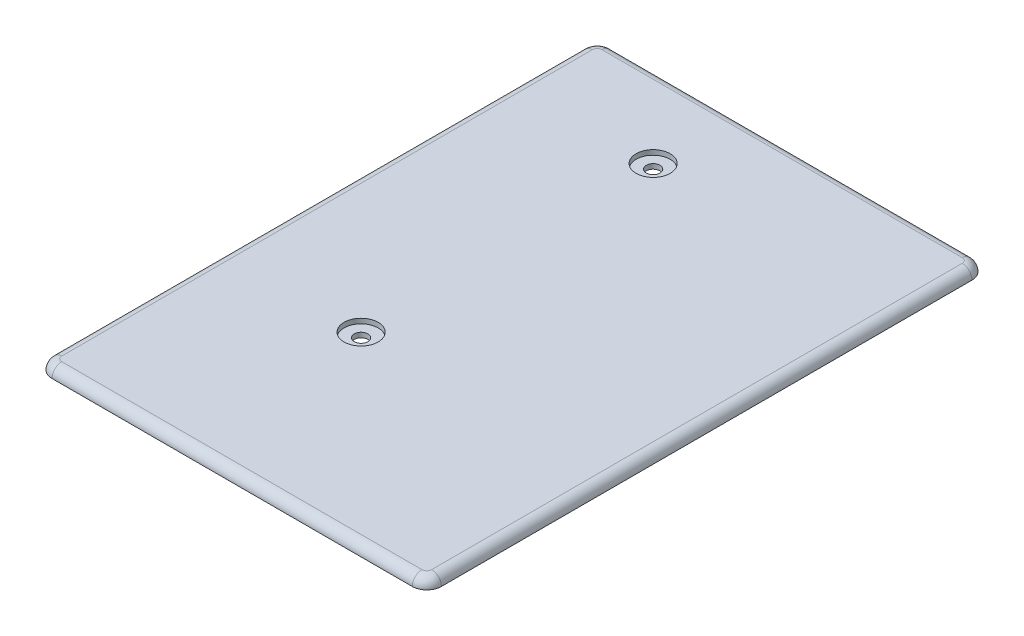
ISO-10303-21;
HEADER;
FILE_DESCRIPTION(('STEP AP214'),'2;1');
FILE_NAME('part.step','',(''),(''),'','','');
FILE_SCHEMA(('AUTOMOTIVE_DESIGN { 1 0 10303 214 1 1 1 1 }'));
ENDSEC;
DATA;
#1=APPLICATION_CONTEXT('core data for automotive mechanical design processes');
#2=APPLICATION_PROTOCOL_DEFINITION('international standard','automotive_design',2000,#1);
#3=PRODUCT_CONTEXT('',#1,'mechanical');
#4=PRODUCT('Part','Part','',(#3));
#5=PRODUCT_RELATED_PRODUCT_CATEGORY('part','',(#4));
#6=PRODUCT_DEFINITION_FORMATION('','',#4);
#7=PRODUCT_DEFINITION_CONTEXT('part definition',#1,'design');
#8=PRODUCT_DEFINITION('design','',#6,#7);
#9=PRODUCT_DEFINITION_SHAPE('','',#8);
#10=(LENGTH_UNIT() NAMED_UNIT(*) SI_UNIT(.MILLI.,.METRE.));
#11=(NAMED_UNIT(*) PLANE_ANGLE_UNIT() SI_UNIT($,.RADIAN.));
#12=(NAMED_UNIT(*) SI_UNIT($,.STERADIAN.) SOLID_ANGLE_UNIT());
#13=UNCERTAINTY_MEASURE_WITH_UNIT(LENGTH_MEASURE(1.E-05),#10,'distance_accuracy_value','');
#14=(GEOMETRIC_REPRESENTATION_CONTEXT(3) GLOBAL_UNCERTAINTY_ASSIGNED_CONTEXT((#13)) GLOBAL_UNIT_ASSIGNED_CONTEXT((#10,
#11,#12)) REPRESENTATION_CONTEXT('',''));
#15=CARTESIAN_POINT('',(0.,0.,0.));
#16=DIRECTION('',(0.,0.,1.));
#17=DIRECTION('',(1.,0.,0.));
#18=AXIS2_PLACEMENT_3D('',#15,#16,#17);
#19=CARTESIAN_POINT('',(28.5,53.,-38.));
#20=DIRECTION('',(0.,1.,0.));
#21=DIRECTION('',(0.,0.,1.));
#22=AXIS2_PLACEMENT_3D('',#19,#20,#21);
#23=CYLINDRICAL_SURFACE('',#22,3.5);
#24=CARTESIAN_POINT('',(28.5,53.,-38.));
#25=DIRECTION('',(0.,1.,0.));
#26=DIRECTION('',(0.,0.,1.));
#27=AXIS2_PLACEMENT_3D('',#24,#25,#26);
#28=CIRCLE('',#27,3.5);
#29=CARTESIAN_POINT('',(28.5,53.,-34.5));
#30=VERTEX_POINT('',#29);
#31=EDGE_CURVE('E117',#30,#30,#28,.T.);
#32=ORIENTED_EDGE('',*,*,#31,.F.);
#33=EDGE_LOOP('',(#32));
#34=FACE_BOUND('',#33,.T.);
#35=CARTESIAN_POINT('',(28.5,54.,-38.));
#36=DIRECTION('',(0.,1.,0.));
#37=DIRECTION('',(0.,0.,1.));
#38=AXIS2_PLACEMENT_3D('',#35,#36,#37);
#39=CIRCLE('',#38,3.5);
#40=CARTESIAN_POINT('',(28.5,54.,-34.5));
#41=VERTEX_POINT('',#40);
#42=EDGE_CURVE('E182',#41,#41,#39,.T.);
#43=ORIENTED_EDGE('',*,*,#42,.T.);
#44=EDGE_LOOP('',(#43));
#45=FACE_BOUND('',#44,.T.);
#46=ADVANCED_FACE('F36',(#34,#45),#23,.F.);
#47=CARTESIAN_POINT('',(28.5,53.,-98.));
#48=DIRECTION('',(0.,1.,0.));
#49=DIRECTION('',(0.,0.,1.));
#50=AXIS2_PLACEMENT_3D('',#47,#48,#49);
#51=CYLINDRICAL_SURFACE('',#50,3.5);
#52=CARTESIAN_POINT('',(28.5,53.,-98.));
#53=DIRECTION('',(0.,1.,0.));
#54=DIRECTION('',(0.,0.,1.));
#55=AXIS2_PLACEMENT_3D('',#52,#53,#54);
#56=CIRCLE('',#55,3.5);
#57=CARTESIAN_POINT('',(28.5,53.,-94.5));
#58=VERTEX_POINT('',#57);
#59=EDGE_CURVE('E179',#58,#58,#56,.T.);
#60=ORIENTED_EDGE('',*,*,#59,.F.);
#61=EDGE_LOOP('',(#60));
#62=FACE_BOUND('',#61,.T.);
#63=CARTESIAN_POINT('',(28.5,54.,-98.));
#64=DIRECTION('',(0.,1.,0.));
#65=DIRECTION('',(0.,0.,1.));
#66=AXIS2_PLACEMENT_3D('',#63,#64,#65);
#67=CIRCLE('',#66,3.5);
#68=CARTESIAN_POINT('',(28.5,54.,-94.5));
#69=VERTEX_POINT('',#68);
#70=EDGE_CURVE('E162',#69,#69,#67,.T.);
#71=ORIENTED_EDGE('',*,*,#70,.T.);
#72=EDGE_LOOP('',(#71));
#73=FACE_BOUND('',#72,.T.);
#74=ADVANCED_FACE('F231',(#62,#73),#51,.F.);
#75=CARTESIAN_POINT('',(2.99999999999999,52.,-112.));
#76=DIRECTION('',(0.,1.,0.));
#77=DIRECTION('',(0.,0.,1.));
#78=AXIS2_PLACEMENT_3D('',#75,#76,#77);
#79=DEGENERATE_TOROIDAL_SURFACE('',#78,1.,2.,.T.);
#80=CARTESIAN_POINT('',(2.99999999999999,52.,-113.));
#81=DIRECTION('',(1.,0.,0.));
#82=DIRECTION('',(0.,0.,-1.));
#83=AXIS2_PLACEMENT_3D('',#80,#81,#82);
#84=CIRCLE('',#83,2.);
#85=CARTESIAN_POINT('',(2.99999999999999,52.,-115.));
#86=VERTEX_POINT('',#85);
#87=CARTESIAN_POINT('',(2.99999999999999,54.,-113.));
#88=VERTEX_POINT('',#87);
#89=EDGE_CURVE('E157',#86,#88,#84,.T.);
#90=ORIENTED_EDGE('',*,*,#89,.F.);
#91=CARTESIAN_POINT('',(2.99999999999999,52.,-112.));
#92=DIRECTION('',(0.,1.,0.));
#93=DIRECTION('',(0.,0.,1.));
#94=AXIS2_PLACEMENT_3D('',#91,#92,#93);
#95=CIRCLE('',#94,3.);
#96=CARTESIAN_POINT('',(0.,52.,-112.));
#97=VERTEX_POINT('',#96);
#98=EDGE_CURVE('E136',#97,#86,#95,.F.);
#99=ORIENTED_EDGE('',*,*,#98,.F.);
#100=CARTESIAN_POINT('',(1.99999999999999,52.,-112.));
#101=DIRECTION('',(0.,0.,1.));
#102=DIRECTION('',(1.,0.,0.));
#103=AXIS2_PLACEMENT_3D('',#100,#101,#102);
#104=CIRCLE('',#103,2.);
#105=CARTESIAN_POINT('',(1.99999999999999,54.,-112.));
#106=VERTEX_POINT('',#105);
#107=EDGE_CURVE('E160',#106,#97,#104,.T.);
#108=ORIENTED_EDGE('',*,*,#107,.F.);
#109=CARTESIAN_POINT('',(2.99999999999999,54.,-112.));
#110=DIRECTION('',(0.,1.,0.));
#111=DIRECTION('',(0.,0.,1.));
#112=AXIS2_PLACEMENT_3D('',#109,#110,#111);
#113=CIRCLE('',#112,1.);
#114=EDGE_CURVE('E197',#88,#106,#113,.T.);
#115=ORIENTED_EDGE('',*,*,#114,.F.);
#116=EDGE_LOOP('',(#90,#99,#108,#115));
#117=FACE_BOUND('',#116,.T.);
#118=ADVANCED_FACE('F38',(#117),#79,.T.);
#119=CARTESIAN_POINT('',(1.99999999999999,52.,-112.));
#120=DIRECTION('',(0.,0.,-1.));
#121=DIRECTION('',(-1.,0.,0.));
#122=AXIS2_PLACEMENT_3D('',#119,#120,#121);
#123=CYLINDRICAL_SURFACE('',#122,2.);
#124=ORIENTED_EDGE('',*,*,#107,.T.);
#125=DIRECTION('',(0.,0.,1.));
#126=VECTOR('',#125,1.);
#127=CARTESIAN_POINT('',(0.,52.,-112.));
#128=LINE('',#127,#126);
#129=CARTESIAN_POINT('',(0.,52.,-3.));
#130=VERTEX_POINT('',#129);
#131=EDGE_CURVE('E134',#130,#97,#128,.F.);
#132=ORIENTED_EDGE('',*,*,#131,.F.);
#133=CARTESIAN_POINT('',(2.,52.,-3.));
#134=DIRECTION('',(0.,0.,1.));
#135=DIRECTION('',(1.,0.,0.));
#136=AXIS2_PLACEMENT_3D('',#133,#134,#135);
#137=CIRCLE('',#136,2.);
#138=CARTESIAN_POINT('',(2.,54.,-3.));
#139=VERTEX_POINT('',#138);
#140=EDGE_CURVE('E154',#139,#130,#137,.T.);
#141=ORIENTED_EDGE('',*,*,#140,.F.);
#142=DIRECTION('',(0.,0.,1.));
#143=VECTOR('',#142,1.);
#144=CARTESIAN_POINT('',(2.,54.,-3.));
#145=LINE('',#144,#143);
#146=EDGE_CURVE('E199',#106,#139,#145,.T.);
#147=ORIENTED_EDGE('',*,*,#146,.F.);
#148=EDGE_LOOP('',(#124,#132,#141,#147));
#149=FACE_BOUND('',#148,.T.);
#150=ADVANCED_FACE('F301',(#149),#123,.T.);
#151=CARTESIAN_POINT('',(2.99999999999999,52.,-113.));
#152=DIRECTION('',(1.,0.,0.));
#153=DIRECTION('',(0.,0.,-1.));
#154=AXIS2_PLACEMENT_3D('',#151,#152,#153);
#155=CYLINDRICAL_SURFACE('',#154,2.);
#156=ORIENTED_EDGE('',*,*,#89,.T.);
#157=DIRECTION('',(-1.,0.,0.));
#158=VECTOR('',#157,1.);
#159=CARTESIAN_POINT('',(2.99999999999999,54.,-113.));
#160=LINE('',#159,#158);
#161=CARTESIAN_POINT('',(77.,54.,-113.));
#162=VERTEX_POINT('',#161);
#163=EDGE_CURVE('E195',#162,#88,#160,.T.);
#164=ORIENTED_EDGE('',*,*,#163,.F.);
#165=CARTESIAN_POINT('',(77.,52.,-113.));
#166=DIRECTION('',(1.,0.,0.));
#167=DIRECTION('',(0.,0.,-1.));
#168=AXIS2_PLACEMENT_3D('',#165,#166,#167);
#169=CIRCLE('',#168,2.);
#170=CARTESIAN_POINT('',(77.,52.,-115.));
#171=VERTEX_POINT('',#170);
#172=EDGE_CURVE('E151',#171,#162,#169,.T.);
#173=ORIENTED_EDGE('',*,*,#172,.F.);
#174=DIRECTION('',(-1.,0.,0.));
#175=VECTOR('',#174,1.);
#176=CARTESIAN_POINT('',(77.,52.,-115.));
#177=LINE('',#176,#175);
#178=EDGE_CURVE('E139',#86,#171,#177,.F.);
#179=ORIENTED_EDGE('',*,*,#178,.F.);
#180=EDGE_LOOP('',(#156,#164,#173,#179));
#181=FACE_BOUND('',#180,.T.);
#182=ADVANCED_FACE('F311',(#181),#155,.T.);
#183=CARTESIAN_POINT('',(3.,52.,-3.));
#184=DIRECTION('',(0.,1.,0.));
#185=DIRECTION('',(0.,0.,1.));
#186=AXIS2_PLACEMENT_3D('',#183,#184,#185);
#187=DEGENERATE_TOROIDAL_SURFACE('',#186,1.,2.,.T.);
#188=ORIENTED_EDGE('',*,*,#140,.T.);
#189=CARTESIAN_POINT('',(3.,52.,-3.));
#190=DIRECTION('',(0.,1.,0.));
#191=DIRECTION('',(0.,0.,1.));
#192=AXIS2_PLACEMENT_3D('',#189,#190,#191);
#193=CIRCLE('',#192,3.);
#194=CARTESIAN_POINT('',(3.,52.,0.));
#195=VERTEX_POINT('',#194);
#196=EDGE_CURVE('E131',#195,#130,#193,.F.);
#197=ORIENTED_EDGE('',*,*,#196,.F.);
#198=CARTESIAN_POINT('',(3.,52.,-2.));
#199=DIRECTION('',(1.,0.,0.));
#200=DIRECTION('',(0.,0.,-1.));
#201=AXIS2_PLACEMENT_3D('',#198,#199,#200);
#202=CIRCLE('',#201,2.);
#203=CARTESIAN_POINT('',(3.,54.,-2.));
#204=VERTEX_POINT('',#203);
#205=EDGE_CURVE('E149',#204,#195,#202,.T.);
#206=ORIENTED_EDGE('',*,*,#205,.F.);
#207=CARTESIAN_POINT('',(3.,54.,-3.));
#208=DIRECTION('',(0.,1.,0.));
#209=DIRECTION('',(0.,0.,1.));
#210=AXIS2_PLACEMENT_3D('',#207,#208,#209);
#211=CIRCLE('',#210,1.);
#212=EDGE_CURVE('E126',#139,#204,#211,.T.);
#213=ORIENTED_EDGE('',*,*,#212,.F.);
#214=EDGE_LOOP('',(#188,#197,#206,#213));
#215=FACE_BOUND('',#214,.T.);
#216=ADVANCED_FACE('F205',(#215),#187,.T.);
#217=CARTESIAN_POINT('',(77.,52.,-112.));
#218=DIRECTION('',(0.,1.,0.));
#219=DIRECTION('',(0.,0.,1.));
#220=AXIS2_PLACEMENT_3D('',#217,#218,#219);
#221=DEGENERATE_TOROIDAL_SURFACE('',#220,1.,2.,.T.);
#222=ORIENTED_EDGE('',*,*,#172,.T.);
#223=CARTESIAN_POINT('',(77.,54.,-112.));
#224=DIRECTION('',(0.,1.,0.));
#225=DIRECTION('',(0.,0.,1.));
#226=AXIS2_PLACEMENT_3D('',#223,#224,#225);
#227=CIRCLE('',#226,1.);
#228=CARTESIAN_POINT('',(78.,54.,-112.));
#229=VERTEX_POINT('',#228);
#230=EDGE_CURVE('E116',#229,#162,#227,.T.);
#231=ORIENTED_EDGE('',*,*,#230,.F.);
#232=CARTESIAN_POINT('',(78.,52.,-112.));
#233=DIRECTION('',(0.,0.,1.));
#234=DIRECTION('',(1.,0.,0.));
#235=AXIS2_PLACEMENT_3D('',#232,#233,#234);
#236=CIRCLE('',#235,2.);
#237=CARTESIAN_POINT('',(80.,52.,-112.));
#238=VERTEX_POINT('',#237);
#239=EDGE_CURVE('E113',#238,#229,#236,.T.);
#240=ORIENTED_EDGE('',*,*,#239,.F.);
#241=CARTESIAN_POINT('',(77.,52.,-112.));
#242=DIRECTION('',(0.,1.,0.));
#243=DIRECTION('',(0.,0.,1.));
#244=AXIS2_PLACEMENT_3D('',#241,#242,#243);
#245=CIRCLE('',#244,3.);
#246=EDGE_CURVE('E142',#171,#238,#245,.F.);
#247=ORIENTED_EDGE('',*,*,#246,.F.);
#248=EDGE_LOOP('',(#222,#231,#240,#247));
#249=FACE_BOUND('',#248,.T.);
#250=ADVANCED_FACE('F228',(#249),#221,.T.);
#251=CARTESIAN_POINT('',(2.99999999999999,54.,-112.));
#252=DIRECTION('',(0.,1.,0.));
#253=DIRECTION('',(0.,0.,1.));
#254=AXIS2_PLACEMENT_3D('',#251,#252,#253);
#255=PLANE('',#254);
#256=DIRECTION('',(1.,0.,0.));
#257=VECTOR('',#256,1.);
#258=CARTESIAN_POINT('',(77.,54.,-2.));
#259=LINE('',#258,#257);
#260=CARTESIAN_POINT('',(77.,54.,-2.));
#261=VERTEX_POINT('',#260);
#262=EDGE_CURVE('E122',#204,#261,#259,.T.);
#263=ORIENTED_EDGE('',*,*,#262,.T.);
#264=CARTESIAN_POINT('',(77.,54.,-3.));
#265=DIRECTION('',(0.,1.,0.));
#266=DIRECTION('',(0.,0.,1.));
#267=AXIS2_PLACEMENT_3D('',#264,#265,#266);
#268=CIRCLE('',#267,1.);
#269=CARTESIAN_POINT('',(78.,54.,-3.));
#270=VERTEX_POINT('',#269);
#271=EDGE_CURVE('E105',#261,#270,#268,.T.);
#272=ORIENTED_EDGE('',*,*,#271,.T.);
#273=DIRECTION('',(0.,0.,-1.));
#274=VECTOR('',#273,1.);
#275=CARTESIAN_POINT('',(78.,54.,-112.));
#276=LINE('',#275,#274);
#277=EDGE_CURVE('E110',#270,#229,#276,.T.);
#278=ORIENTED_EDGE('',*,*,#277,.T.);
#279=ORIENTED_EDGE('',*,*,#230,.T.);
#280=ORIENTED_EDGE('',*,*,#163,.T.);
#281=ORIENTED_EDGE('',*,*,#114,.T.);
#282=ORIENTED_EDGE('',*,*,#146,.T.);
#283=ORIENTED_EDGE('',*,*,#212,.T.);
#284=EDGE_LOOP('',(#263,#272,#278,#279,#280,#281,#282,#283));
#285=FACE_BOUND('',#284,.T.);
#286=ORIENTED_EDGE('',*,*,#70,.F.);
#287=EDGE_LOOP('',(#286));
#288=FACE_BOUND('',#287,.T.);
#289=ORIENTED_EDGE('',*,*,#42,.F.);
#290=EDGE_LOOP('',(#289));
#291=FACE_BOUND('',#290,.T.);
#292=ADVANCED_FACE('F119',(#285,#288,#291),#255,.T.);
#293=CARTESIAN_POINT('',(78.,52.,-112.));
#294=DIRECTION('',(0.,0.,1.));
#295=DIRECTION('',(1.,0.,0.));
#296=AXIS2_PLACEMENT_3D('',#293,#294,#295);
#297=CYLINDRICAL_SURFACE('',#296,2.);
#298=ORIENTED_EDGE('',*,*,#239,.T.);
#299=ORIENTED_EDGE('',*,*,#277,.F.);
#300=CARTESIAN_POINT('',(78.,52.,-3.));
#301=DIRECTION('',(0.,0.,1.));
#302=DIRECTION('',(1.,0.,0.));
#303=AXIS2_PLACEMENT_3D('',#300,#301,#302);
#304=CIRCLE('',#303,2.);
#305=CARTESIAN_POINT('',(80.,52.,-3.));
#306=VERTEX_POINT('',#305);
#307=EDGE_CURVE('E101',#306,#270,#304,.T.);
#308=ORIENTED_EDGE('',*,*,#307,.F.);
#309=DIRECTION('',(0.,0.,-1.));
#310=VECTOR('',#309,1.);
#311=CARTESIAN_POINT('',(80.,52.,-3.));
#312=LINE('',#311,#310);
#313=EDGE_CURVE('E145',#238,#306,#312,.F.);
#314=ORIENTED_EDGE('',*,*,#313,.F.);
#315=EDGE_LOOP('',(#298,#299,#308,#314));
#316=FACE_BOUND('',#315,.T.);
#317=ADVANCED_FACE('F111',(#316),#297,.T.);
#318=CARTESIAN_POINT('',(2.99999999999999,52.,-2.));
#319=DIRECTION('',(-1.,0.,0.));
#320=DIRECTION('',(0.,0.,1.));
#321=AXIS2_PLACEMENT_3D('',#318,#319,#320);
#322=CYLINDRICAL_SURFACE('',#321,2.);
#323=ORIENTED_EDGE('',*,*,#205,.T.);
#324=DIRECTION('',(1.,0.,0.));
#325=VECTOR('',#324,1.);
#326=CARTESIAN_POINT('',(3.,52.,0.));
#327=LINE('',#326,#325);
#328=CARTESIAN_POINT('',(77.,52.,0.));
#329=VERTEX_POINT('',#328);
#330=EDGE_CURVE('E45',#329,#195,#327,.F.);
#331=ORIENTED_EDGE('',*,*,#330,.F.);
#332=CARTESIAN_POINT('',(77.,52.,-2.));
#333=DIRECTION('',(1.,0.,0.));
#334=DIRECTION('',(0.,0.,-1.));
#335=AXIS2_PLACEMENT_3D('',#332,#333,#334);
#336=CIRCLE('',#335,2.);
#337=EDGE_CURVE('E107',#261,#329,#336,.T.);
#338=ORIENTED_EDGE('',*,*,#337,.F.);
#339=ORIENTED_EDGE('',*,*,#262,.F.);
#340=EDGE_LOOP('',(#323,#331,#338,#339));
#341=FACE_BOUND('',#340,.T.);
#342=ADVANCED_FACE('F206',(#341),#322,.T.);
#343=CARTESIAN_POINT('',(77.,52.,-3.));
#344=DIRECTION('',(0.,1.,0.));
#345=DIRECTION('',(0.,0.,1.));
#346=AXIS2_PLACEMENT_3D('',#343,#344,#345);
#347=DEGENERATE_TOROIDAL_SURFACE('',#346,1.,2.,.T.);
#348=ORIENTED_EDGE('',*,*,#337,.T.);
#349=CARTESIAN_POINT('',(77.,52.,-3.));
#350=DIRECTION('',(0.,1.,0.));
#351=DIRECTION('',(0.,0.,1.));
#352=AXIS2_PLACEMENT_3D('',#349,#350,#351);
#353=CIRCLE('',#352,3.);
#354=EDGE_CURVE('E11',#306,#329,#353,.F.);
#355=ORIENTED_EDGE('',*,*,#354,.F.);
#356=ORIENTED_EDGE('',*,*,#307,.T.);
#357=ORIENTED_EDGE('',*,*,#271,.F.);
#358=EDGE_LOOP('',(#348,#355,#356,#357));
#359=FACE_BOUND('',#358,.T.);
#360=ADVANCED_FACE('F103',(#359),#347,.T.);
#361=CARTESIAN_POINT('',(0.,53.,0.));
#362=DIRECTION('',(0.,1.,0.));
#363=DIRECTION('',(0.,0.,1.));
#364=AXIS2_PLACEMENT_3D('',#361,#362,#363);
#365=PLANE('',#364);
#366=CARTESIAN_POINT('',(28.5,53.,-98.));
#367=DIRECTION('',(0.,1.,0.));
#368=DIRECTION('',(0.,0.,1.));
#369=AXIS2_PLACEMENT_3D('',#366,#367,#368);
#370=CIRCLE('',#369,1.397);
#371=CARTESIAN_POINT('',(28.5,53.,-96.603));
#372=VERTEX_POINT('',#371);
#373=EDGE_CURVE('E177',#372,#372,#370,.F.);
#374=ORIENTED_EDGE('',*,*,#373,.T.);
#375=EDGE_LOOP('',(#374));
#376=FACE_BOUND('',#375,.T.);
#377=ORIENTED_EDGE('',*,*,#59,.T.);
#378=EDGE_LOOP('',(#377));
#379=FACE_BOUND('',#378,.T.);
#380=ADVANCED_FACE('F173',(#376,#379),#365,.T.);
#381=CARTESIAN_POINT('',(28.5,52.,-98.));
#382=DIRECTION('',(0.,-1.,0.));
#383=DIRECTION('',(0.,0.,-1.));
#384=AXIS2_PLACEMENT_3D('',#381,#382,#383);
#385=CYLINDRICAL_SURFACE('',#384,1.397);
#386=CARTESIAN_POINT('',(28.5,52.,-98.));
#387=DIRECTION('',(0.,1.,0.));
#388=DIRECTION('',(0.,0.,1.));
#389=AXIS2_PLACEMENT_3D('',#386,#387,#388);
#390=CIRCLE('',#389,1.397);
#391=CARTESIAN_POINT('',(28.5,52.,-96.603));
#392=VERTEX_POINT('',#391);
#393=EDGE_CURVE('E125',#392,#392,#390,.T.);
#394=ORIENTED_EDGE('',*,*,#393,.F.);
#395=EDGE_LOOP('',(#394));
#396=FACE_BOUND('',#395,.T.);
#397=ORIENTED_EDGE('',*,*,#373,.F.);
#398=EDGE_LOOP('',(#397));
#399=FACE_BOUND('',#398,.T.);
#400=ADVANCED_FACE('F169',(#396,#399),#385,.F.);
#401=CARTESIAN_POINT('',(0.,53.,0.));
#402=DIRECTION('',(0.,1.,0.));
#403=DIRECTION('',(0.,0.,1.));
#404=AXIS2_PLACEMENT_3D('',#401,#402,#403);
#405=PLANE('',#404);
#406=CARTESIAN_POINT('',(28.5,53.,-38.));
#407=DIRECTION('',(0.,1.,0.));
#408=DIRECTION('',(0.,0.,1.));
#409=AXIS2_PLACEMENT_3D('',#406,#407,#408);
#410=CIRCLE('',#409,1.397);
#411=CARTESIAN_POINT('',(28.5,53.,-36.603));
#412=VERTEX_POINT('',#411);
#413=EDGE_CURVE('E187',#412,#412,#410,.F.);
#414=ORIENTED_EDGE('',*,*,#413,.T.);
#415=EDGE_LOOP('',(#414));
#416=FACE_BOUND('',#415,.T.);
#417=ORIENTED_EDGE('',*,*,#31,.T.);
#418=EDGE_LOOP('',(#417));
#419=FACE_BOUND('',#418,.T.);
#420=ADVANCED_FACE('F172',(#416,#419),#405,.T.);
#421=CARTESIAN_POINT('',(28.5,52.,-38.));
#422=DIRECTION('',(0.,-1.,0.));
#423=DIRECTION('',(0.,0.,-1.));
#424=AXIS2_PLACEMENT_3D('',#421,#422,#423);
#425=CYLINDRICAL_SURFACE('',#424,1.397);
#426=CARTESIAN_POINT('',(28.5,52.,-38.));
#427=DIRECTION('',(0.,1.,0.));
#428=DIRECTION('',(0.,0.,1.));
#429=AXIS2_PLACEMENT_3D('',#426,#427,#428);
#430=CIRCLE('',#429,1.397);
#431=CARTESIAN_POINT('',(28.5,52.,-36.603));
#432=VERTEX_POINT('',#431);
#433=EDGE_CURVE('E40',#432,#432,#430,.T.);
#434=ORIENTED_EDGE('',*,*,#433,.F.);
#435=EDGE_LOOP('',(#434));
#436=FACE_BOUND('',#435,.T.);
#437=ORIENTED_EDGE('',*,*,#413,.F.);
#438=EDGE_LOOP('',(#437));
#439=FACE_BOUND('',#438,.T.);
#440=ADVANCED_FACE('F217',(#436,#439),#425,.F.);
#441=CARTESIAN_POINT('',(2.99999999999999,52.,-112.));
#442=DIRECTION('',(0.,1.,0.));
#443=DIRECTION('',(0.,0.,1.));
#444=AXIS2_PLACEMENT_3D('',#441,#442,#443);
#445=PLANE('',#444);
#446=ORIENTED_EDGE('',*,*,#433,.T.);
#447=EDGE_LOOP('',(#446));
#448=FACE_BOUND('',#447,.T.);
#449=ORIENTED_EDGE('',*,*,#393,.T.);
#450=EDGE_LOOP('',(#449));
#451=FACE_BOUND('',#450,.T.);
#452=ORIENTED_EDGE('',*,*,#98,.T.);
#453=ORIENTED_EDGE('',*,*,#178,.T.);
#454=ORIENTED_EDGE('',*,*,#246,.T.);
#455=ORIENTED_EDGE('',*,*,#313,.T.);
#456=ORIENTED_EDGE('',*,*,#354,.T.);
#457=ORIENTED_EDGE('',*,*,#330,.T.);
#458=ORIENTED_EDGE('',*,*,#196,.T.);
#459=ORIENTED_EDGE('',*,*,#131,.T.);
#460=EDGE_LOOP('',(#452,#453,#454,#455,#456,#457,#458,#459));
#461=FACE_BOUND('',#460,.T.);
#462=ADVANCED_FACE('F166',(#448,#451,#461),#445,.F.);
#463=CLOSED_SHELL('',(#46,#74,#118,#150,#182,#216,#250,#292,#317,#342,#360,#380,#400,#420,#440,#462));
#464=MANIFOLD_SOLID_BREP('B2',#463);
#465=ADVANCED_BREP_SHAPE_REPRESENTATION('',(#18,#464),#14);
#466=SHAPE_DEFINITION_REPRESENTATION(#9,#465);
ENDSEC;
END-ISO-10303-21;
